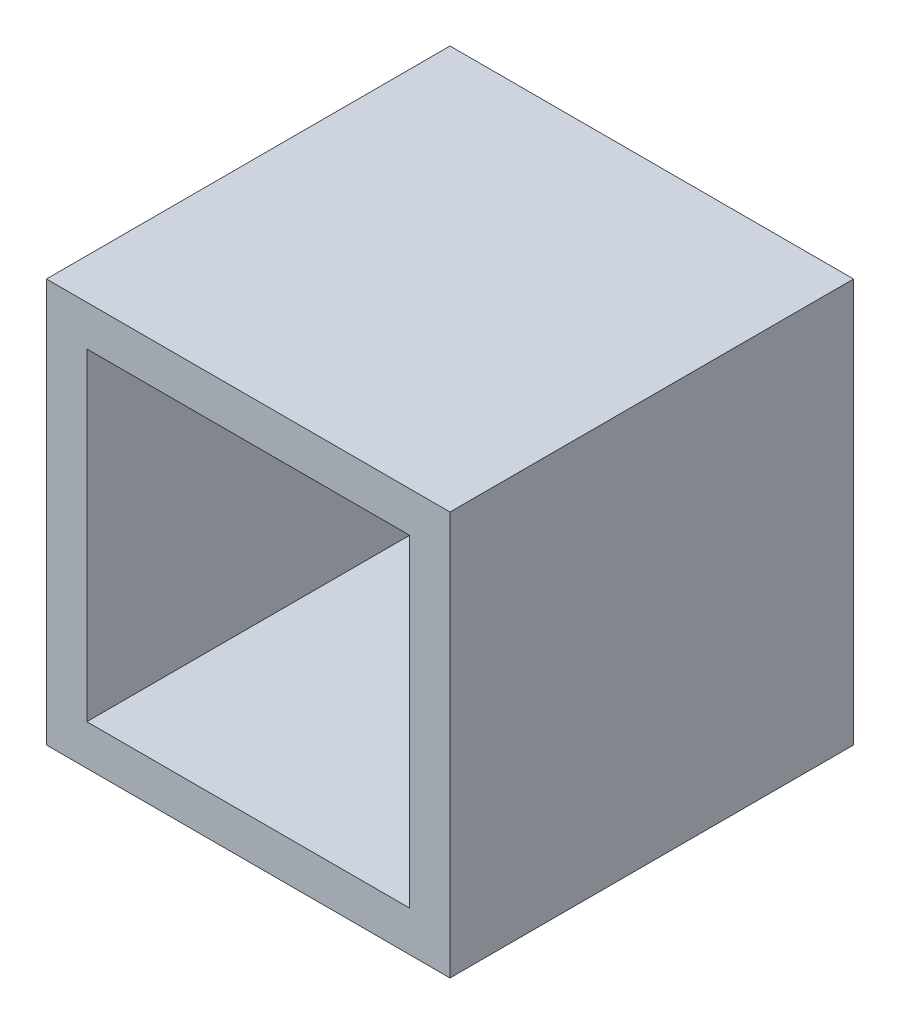
ISO-10303-21;
HEADER;
FILE_DESCRIPTION(('STEP AP214'),'2;1');
FILE_NAME('part.step','',(''),(''),'','','');
FILE_SCHEMA(('AUTOMOTIVE_DESIGN { 1 0 10303 214 1 1 1 1 }'));
ENDSEC;
DATA;
#1=APPLICATION_CONTEXT('core data for automotive mechanical design processes');
#2=APPLICATION_PROTOCOL_DEFINITION('international standard','automotive_design',2000,#1);
#3=PRODUCT_CONTEXT('',#1,'mechanical');
#4=PRODUCT('Part','Part','',(#3));
#5=PRODUCT_RELATED_PRODUCT_CATEGORY('part','',(#4));
#6=PRODUCT_DEFINITION_FORMATION('','',#4);
#7=PRODUCT_DEFINITION_CONTEXT('part definition',#1,'design');
#8=PRODUCT_DEFINITION('design','',#6,#7);
#9=PRODUCT_DEFINITION_SHAPE('','',#8);
#10=(LENGTH_UNIT() NAMED_UNIT(*) SI_UNIT(.MILLI.,.METRE.));
#11=(NAMED_UNIT(*) PLANE_ANGLE_UNIT() SI_UNIT($,.RADIAN.));
#12=(NAMED_UNIT(*) SI_UNIT($,.STERADIAN.) SOLID_ANGLE_UNIT());
#13=UNCERTAINTY_MEASURE_WITH_UNIT(LENGTH_MEASURE(1.E-05),#10,'distance_accuracy_value','');
#14=(GEOMETRIC_REPRESENTATION_CONTEXT(3) GLOBAL_UNCERTAINTY_ASSIGNED_CONTEXT((#13)) GLOBAL_UNIT_ASSIGNED_CONTEXT((#10,
#11,#12)) REPRESENTATION_CONTEXT('',''));
#15=CARTESIAN_POINT('',(0.,0.,0.));
#16=DIRECTION('',(0.,0.,1.));
#17=DIRECTION('',(1.,0.,0.));
#18=AXIS2_PLACEMENT_3D('',#15,#16,#17);
#19=CARTESIAN_POINT('',(0.,0.,10.));
#20=DIRECTION('',(0.,0.,-1.));
#21=DIRECTION('',(-1.,0.,0.));
#22=AXIS2_PLACEMENT_3D('',#19,#20,#21);
#23=PLANE('',#22);
#24=DIRECTION('',(0.,1.,0.));
#25=VECTOR('',#24,1.);
#26=CARTESIAN_POINT('',(5.,-5.,10.));
#27=LINE('',#26,#25);
#28=CARTESIAN_POINT('',(5.,-5.,10.));
#29=VERTEX_POINT('',#28);
#30=CARTESIAN_POINT('',(5.,5.,10.));
#31=VERTEX_POINT('',#30);
#32=EDGE_CURVE('E137',#29,#31,#27,.T.);
#33=ORIENTED_EDGE('',*,*,#32,.T.);
#34=DIRECTION('',(-1.,0.,0.));
#35=VECTOR('',#34,1.);
#36=CARTESIAN_POINT('',(-5.,5.,10.));
#37=LINE('',#36,#35);
#38=CARTESIAN_POINT('',(-5.,5.,10.));
#39=VERTEX_POINT('',#38);
#40=EDGE_CURVE('E140',#31,#39,#37,.T.);
#41=ORIENTED_EDGE('',*,*,#40,.T.);
#42=DIRECTION('',(0.,-1.,0.));
#43=VECTOR('',#42,1.);
#44=CARTESIAN_POINT('',(-5.,-5.,10.));
#45=LINE('',#44,#43);
#46=CARTESIAN_POINT('',(-5.,-5.,10.));
#47=VERTEX_POINT('',#46);
#48=EDGE_CURVE('E143',#39,#47,#45,.T.);
#49=ORIENTED_EDGE('',*,*,#48,.T.);
#50=DIRECTION('',(1.,0.,0.));
#51=VECTOR('',#50,1.);
#52=CARTESIAN_POINT('',(-5.,-5.,10.));
#53=LINE('',#52,#51);
#54=EDGE_CURVE('E145',#47,#29,#53,.T.);
#55=ORIENTED_EDGE('',*,*,#54,.T.);
#56=EDGE_LOOP('',(#33,#41,#49,#55));
#57=FACE_BOUND('',#56,.T.);
#58=DIRECTION('',(0.,1.,0.));
#59=VECTOR('',#58,1.);
#60=CARTESIAN_POINT('',(4.,-4.,10.));
#61=LINE('',#60,#59);
#62=CARTESIAN_POINT('',(4.,-4.,10.));
#63=VERTEX_POINT('',#62);
#64=CARTESIAN_POINT('',(4.,4.,10.));
#65=VERTEX_POINT('',#64);
#66=EDGE_CURVE('E101',#63,#65,#61,.T.);
#67=ORIENTED_EDGE('',*,*,#66,.F.);
#68=DIRECTION('',(1.,0.,0.));
#69=VECTOR('',#68,1.);
#70=CARTESIAN_POINT('',(-4.,-4.,10.));
#71=LINE('',#70,#69);
#72=CARTESIAN_POINT('',(-4.,-4.,10.));
#73=VERTEX_POINT('',#72);
#74=EDGE_CURVE('E123',#73,#63,#71,.T.);
#75=ORIENTED_EDGE('',*,*,#74,.F.);
#76=DIRECTION('',(0.,-1.,0.));
#77=VECTOR('',#76,1.);
#78=CARTESIAN_POINT('',(-4.,-4.,10.));
#79=LINE('',#78,#77);
#80=CARTESIAN_POINT('',(-4.,4.,10.));
#81=VERTEX_POINT('',#80);
#82=EDGE_CURVE('E121',#81,#73,#79,.T.);
#83=ORIENTED_EDGE('',*,*,#82,.F.);
#84=DIRECTION('',(-1.,0.,0.));
#85=VECTOR('',#84,1.);
#86=CARTESIAN_POINT('',(-4.,4.,10.));
#87=LINE('',#86,#85);
#88=EDGE_CURVE('E109',#65,#81,#87,.T.);
#89=ORIENTED_EDGE('',*,*,#88,.F.);
#90=EDGE_LOOP('',(#67,#75,#83,#89));
#91=FACE_BOUND('',#90,.T.);
#92=ADVANCED_FACE('F36',(#57,#91),#23,.F.);
#93=CARTESIAN_POINT('',(0.,0.,0.));
#94=DIRECTION('',(0.,0.,-1.));
#95=DIRECTION('',(-1.,0.,0.));
#96=AXIS2_PLACEMENT_3D('',#93,#94,#95);
#97=PLANE('',#96);
#98=DIRECTION('',(0.,1.,0.));
#99=VECTOR('',#98,1.);
#100=CARTESIAN_POINT('',(5.,-5.,0.));
#101=LINE('',#100,#99);
#102=CARTESIAN_POINT('',(5.,-5.,0.));
#103=VERTEX_POINT('',#102);
#104=CARTESIAN_POINT('',(5.,5.,0.));
#105=VERTEX_POINT('',#104);
#106=EDGE_CURVE('E117',#103,#105,#101,.T.);
#107=ORIENTED_EDGE('',*,*,#106,.F.);
#108=DIRECTION('',(1.,0.,0.));
#109=VECTOR('',#108,1.);
#110=CARTESIAN_POINT('',(-5.,-5.,0.));
#111=LINE('',#110,#109);
#112=CARTESIAN_POINT('',(-5.,-5.,0.));
#113=VERTEX_POINT('',#112);
#114=EDGE_CURVE('E141',#113,#103,#111,.T.);
#115=ORIENTED_EDGE('',*,*,#114,.F.);
#116=DIRECTION('',(0.,-1.,0.));
#117=VECTOR('',#116,1.);
#118=CARTESIAN_POINT('',(-5.,-5.,0.));
#119=LINE('',#118,#117);
#120=CARTESIAN_POINT('',(-5.,5.,0.));
#121=VERTEX_POINT('',#120);
#122=EDGE_CURVE('E152',#121,#113,#119,.T.);
#123=ORIENTED_EDGE('',*,*,#122,.F.);
#124=DIRECTION('',(-1.,0.,0.));
#125=VECTOR('',#124,1.);
#126=CARTESIAN_POINT('',(-5.,5.,0.));
#127=LINE('',#126,#125);
#128=EDGE_CURVE('E150',#105,#121,#127,.T.);
#129=ORIENTED_EDGE('',*,*,#128,.F.);
#130=EDGE_LOOP('',(#107,#115,#123,#129));
#131=FACE_BOUND('',#130,.T.);
#132=DIRECTION('',(1.,0.,0.));
#133=VECTOR('',#132,1.);
#134=CARTESIAN_POINT('',(-4.,-4.,0.));
#135=LINE('',#134,#133);
#136=CARTESIAN_POINT('',(-4.,-4.,0.));
#137=VERTEX_POINT('',#136);
#138=CARTESIAN_POINT('',(4.,-4.,0.));
#139=VERTEX_POINT('',#138);
#140=EDGE_CURVE('E110',#137,#139,#135,.T.);
#141=ORIENTED_EDGE('',*,*,#140,.T.);
#142=DIRECTION('',(0.,1.,0.));
#143=VECTOR('',#142,1.);
#144=CARTESIAN_POINT('',(4.,-4.,0.));
#145=LINE('',#144,#143);
#146=CARTESIAN_POINT('',(4.,4.,0.));
#147=VERTEX_POINT('',#146);
#148=EDGE_CURVE('E59',#139,#147,#145,.T.);
#149=ORIENTED_EDGE('',*,*,#148,.T.);
#150=DIRECTION('',(-1.,0.,0.));
#151=VECTOR('',#150,1.);
#152=CARTESIAN_POINT('',(-4.,4.,0.));
#153=LINE('',#152,#151);
#154=CARTESIAN_POINT('',(-4.,4.,0.));
#155=VERTEX_POINT('',#154);
#156=EDGE_CURVE('E116',#147,#155,#153,.T.);
#157=ORIENTED_EDGE('',*,*,#156,.T.);
#158=DIRECTION('',(0.,-1.,0.));
#159=VECTOR('',#158,1.);
#160=CARTESIAN_POINT('',(-4.,-4.,0.));
#161=LINE('',#160,#159);
#162=EDGE_CURVE('E129',#155,#137,#161,.T.);
#163=ORIENTED_EDGE('',*,*,#162,.T.);
#164=EDGE_LOOP('',(#141,#149,#157,#163));
#165=FACE_BOUND('',#164,.T.);
#166=ADVANCED_FACE('F170',(#131,#165),#97,.T.);
#167=CARTESIAN_POINT('',(5.,-5.,10.));
#168=DIRECTION('',(-1.,0.,0.));
#169=DIRECTION('',(0.,0.,1.));
#170=AXIS2_PLACEMENT_3D('',#167,#168,#169);
#171=PLANE('',#170);
#172=ORIENTED_EDGE('',*,*,#106,.T.);
#173=DIRECTION('',(0.,0.,-1.));
#174=VECTOR('',#173,1.);
#175=CARTESIAN_POINT('',(5.,5.,10.));
#176=LINE('',#175,#174);
#177=EDGE_CURVE('E11',#31,#105,#176,.T.);
#178=ORIENTED_EDGE('',*,*,#177,.F.);
#179=ORIENTED_EDGE('',*,*,#32,.F.);
#180=DIRECTION('',(0.,0.,-1.));
#181=VECTOR('',#180,1.);
#182=CARTESIAN_POINT('',(5.,-5.,10.));
#183=LINE('',#182,#181);
#184=EDGE_CURVE('E147',#29,#103,#183,.T.);
#185=ORIENTED_EDGE('',*,*,#184,.T.);
#186=EDGE_LOOP('',(#172,#178,#179,#185));
#187=FACE_BOUND('',#186,.T.);
#188=ADVANCED_FACE('F38',(#187),#171,.F.);
#189=CARTESIAN_POINT('',(-5.,5.,10.));
#190=DIRECTION('',(0.,-1.,0.));
#191=DIRECTION('',(0.,0.,-1.));
#192=AXIS2_PLACEMENT_3D('',#189,#190,#191);
#193=PLANE('',#192);
#194=ORIENTED_EDGE('',*,*,#128,.T.);
#195=DIRECTION('',(0.,0.,-1.));
#196=VECTOR('',#195,1.);
#197=CARTESIAN_POINT('',(-5.,5.,10.));
#198=LINE('',#197,#196);
#199=EDGE_CURVE('E44',#39,#121,#198,.T.);
#200=ORIENTED_EDGE('',*,*,#199,.F.);
#201=ORIENTED_EDGE('',*,*,#40,.F.);
#202=ORIENTED_EDGE('',*,*,#177,.T.);
#203=EDGE_LOOP('',(#194,#200,#201,#202));
#204=FACE_BOUND('',#203,.T.);
#205=ADVANCED_FACE('F180',(#204),#193,.F.);
#206=CARTESIAN_POINT('',(-5.,-5.,10.));
#207=DIRECTION('',(1.,0.,0.));
#208=DIRECTION('',(0.,0.,-1.));
#209=AXIS2_PLACEMENT_3D('',#206,#207,#208);
#210=PLANE('',#209);
#211=ORIENTED_EDGE('',*,*,#122,.T.);
#212=DIRECTION('',(0.,0.,-1.));
#213=VECTOR('',#212,1.);
#214=CARTESIAN_POINT('',(-5.,-5.,10.));
#215=LINE('',#214,#213);
#216=EDGE_CURVE('E157',#47,#113,#215,.T.);
#217=ORIENTED_EDGE('',*,*,#216,.F.);
#218=ORIENTED_EDGE('',*,*,#48,.F.);
#219=ORIENTED_EDGE('',*,*,#199,.T.);
#220=EDGE_LOOP('',(#211,#217,#218,#219));
#221=FACE_BOUND('',#220,.T.);
#222=ADVANCED_FACE('F164',(#221),#210,.F.);
#223=CARTESIAN_POINT('',(-5.,-5.,10.));
#224=DIRECTION('',(0.,1.,0.));
#225=DIRECTION('',(0.,0.,1.));
#226=AXIS2_PLACEMENT_3D('',#223,#224,#225);
#227=PLANE('',#226);
#228=ORIENTED_EDGE('',*,*,#114,.T.);
#229=ORIENTED_EDGE('',*,*,#184,.F.);
#230=ORIENTED_EDGE('',*,*,#54,.F.);
#231=ORIENTED_EDGE('',*,*,#216,.T.);
#232=EDGE_LOOP('',(#228,#229,#230,#231));
#233=FACE_BOUND('',#232,.T.);
#234=ADVANCED_FACE('F174',(#233),#227,.F.);
#235=CARTESIAN_POINT('',(4.,-4.,10.));
#236=DIRECTION('',(-1.,0.,0.));
#237=DIRECTION('',(0.,0.,1.));
#238=AXIS2_PLACEMENT_3D('',#235,#236,#237);
#239=PLANE('',#238);
#240=ORIENTED_EDGE('',*,*,#148,.F.);
#241=DIRECTION('',(0.,0.,-1.));
#242=VECTOR('',#241,1.);
#243=CARTESIAN_POINT('',(4.,-4.,10.));
#244=LINE('',#243,#242);
#245=EDGE_CURVE('E105',#63,#139,#244,.T.);
#246=ORIENTED_EDGE('',*,*,#245,.F.);
#247=ORIENTED_EDGE('',*,*,#66,.T.);
#248=DIRECTION('',(0.,0.,-1.));
#249=VECTOR('',#248,1.);
#250=CARTESIAN_POINT('',(4.,4.,10.));
#251=LINE('',#250,#249);
#252=EDGE_CURVE('E104',#65,#147,#251,.T.);
#253=ORIENTED_EDGE('',*,*,#252,.T.);
#254=EDGE_LOOP('',(#240,#246,#247,#253));
#255=FACE_BOUND('',#254,.T.);
#256=ADVANCED_FACE('F103',(#255),#239,.T.);
#257=CARTESIAN_POINT('',(-4.,4.,10.));
#258=DIRECTION('',(0.,-1.,0.));
#259=DIRECTION('',(0.,0.,-1.));
#260=AXIS2_PLACEMENT_3D('',#257,#258,#259);
#261=PLANE('',#260);
#262=ORIENTED_EDGE('',*,*,#156,.F.);
#263=ORIENTED_EDGE('',*,*,#252,.F.);
#264=ORIENTED_EDGE('',*,*,#88,.T.);
#265=DIRECTION('',(0.,0.,-1.));
#266=VECTOR('',#265,1.);
#267=CARTESIAN_POINT('',(-4.,4.,10.));
#268=LINE('',#267,#266);
#269=EDGE_CURVE('E118',#81,#155,#268,.T.);
#270=ORIENTED_EDGE('',*,*,#269,.T.);
#271=EDGE_LOOP('',(#262,#263,#264,#270));
#272=FACE_BOUND('',#271,.T.);
#273=ADVANCED_FACE('F113',(#272),#261,.T.);
#274=CARTESIAN_POINT('',(-4.,-4.,10.));
#275=DIRECTION('',(1.,0.,0.));
#276=DIRECTION('',(0.,0.,-1.));
#277=AXIS2_PLACEMENT_3D('',#274,#275,#276);
#278=PLANE('',#277);
#279=ORIENTED_EDGE('',*,*,#162,.F.);
#280=ORIENTED_EDGE('',*,*,#269,.F.);
#281=ORIENTED_EDGE('',*,*,#82,.T.);
#282=DIRECTION('',(0.,0.,-1.));
#283=VECTOR('',#282,1.);
#284=CARTESIAN_POINT('',(-4.,-4.,10.));
#285=LINE('',#284,#283);
#286=EDGE_CURVE('E51',#73,#137,#285,.T.);
#287=ORIENTED_EDGE('',*,*,#286,.T.);
#288=EDGE_LOOP('',(#279,#280,#281,#287));
#289=FACE_BOUND('',#288,.T.);
#290=ADVANCED_FACE('F203',(#289),#278,.T.);
#291=CARTESIAN_POINT('',(-4.,-4.,10.));
#292=DIRECTION('',(0.,1.,0.));
#293=DIRECTION('',(0.,0.,1.));
#294=AXIS2_PLACEMENT_3D('',#291,#292,#293);
#295=PLANE('',#294);
#296=ORIENTED_EDGE('',*,*,#140,.F.);
#297=ORIENTED_EDGE('',*,*,#286,.F.);
#298=ORIENTED_EDGE('',*,*,#74,.T.);
#299=ORIENTED_EDGE('',*,*,#245,.T.);
#300=EDGE_LOOP('',(#296,#297,#298,#299));
#301=FACE_BOUND('',#300,.T.);
#302=ADVANCED_FACE('F207',(#301),#295,.T.);
#303=CLOSED_SHELL('',(#92,#166,#188,#205,#222,#234,#256,#273,#290,#302));
#304=MANIFOLD_SOLID_BREP('B2',#303);
#305=ADVANCED_BREP_SHAPE_REPRESENTATION('',(#18,#304),#14);
#306=SHAPE_DEFINITION_REPRESENTATION(#9,#305);
ENDSEC;
END-ISO-10303-21;
